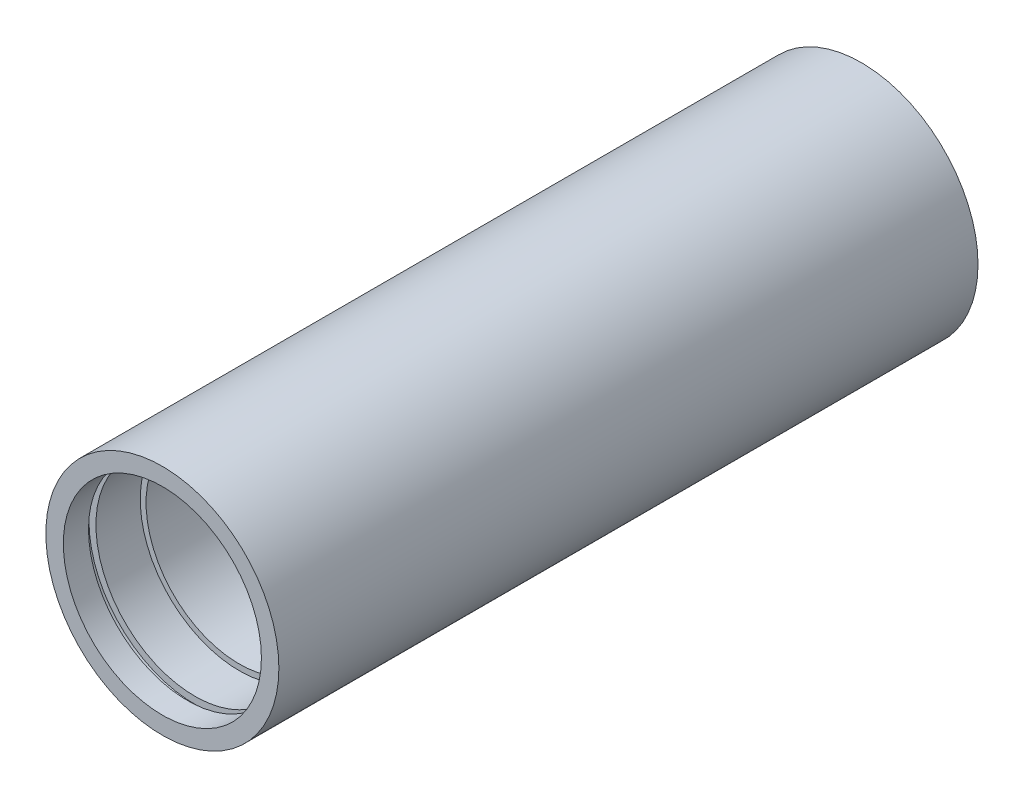
ISO-10303-21;
HEADER;
FILE_DESCRIPTION(('STEP AP214'),'2;1');
FILE_NAME('part.step','',(''),(''),'','','');
FILE_SCHEMA(('AUTOMOTIVE_DESIGN { 1 0 10303 214 1 1 1 1 }'));
ENDSEC;
DATA;
#1=APPLICATION_CONTEXT('core data for automotive mechanical design processes');
#2=APPLICATION_PROTOCOL_DEFINITION('international standard','automotive_design',2000,#1);
#3=PRODUCT_CONTEXT('',#1,'mechanical');
#4=PRODUCT('Part','Part','',(#3));
#5=PRODUCT_RELATED_PRODUCT_CATEGORY('part','',(#4));
#6=PRODUCT_DEFINITION_FORMATION('','',#4);
#7=PRODUCT_DEFINITION_CONTEXT('part definition',#1,'design');
#8=PRODUCT_DEFINITION('design','',#6,#7);
#9=PRODUCT_DEFINITION_SHAPE('','',#8);
#10=(LENGTH_UNIT() NAMED_UNIT(*) SI_UNIT(.MILLI.,.METRE.));
#11=(NAMED_UNIT(*) PLANE_ANGLE_UNIT() SI_UNIT($,.RADIAN.));
#12=(NAMED_UNIT(*) SI_UNIT($,.STERADIAN.) SOLID_ANGLE_UNIT());
#13=UNCERTAINTY_MEASURE_WITH_UNIT(LENGTH_MEASURE(1.E-05),#10,'distance_accuracy_value','');
#14=(GEOMETRIC_REPRESENTATION_CONTEXT(3) GLOBAL_UNCERTAINTY_ASSIGNED_CONTEXT((#13)) GLOBAL_UNIT_ASSIGNED_CONTEXT((#10,
#11,#12)) REPRESENTATION_CONTEXT('',''));
#15=CARTESIAN_POINT('',(0.,0.,0.));
#16=DIRECTION('',(0.,0.,1.));
#17=DIRECTION('',(1.,0.,0.));
#18=AXIS2_PLACEMENT_3D('',#15,#16,#17);
#19=CARTESIAN_POINT('',(0.,0.,-117.));
#20=DIRECTION('',(0.,0.,-1.));
#21=DIRECTION('',(-1.,0.,0.));
#22=AXIS2_PLACEMENT_3D('',#19,#20,#21);
#23=CYLINDRICAL_SURFACE('',#22,42.5);
#24=CARTESIAN_POINT('',(0.,0.,-150.));
#25=DIRECTION('',(0.,0.,1.));
#26=DIRECTION('',(1.,0.,0.));
#27=AXIS2_PLACEMENT_3D('',#24,#25,#26);
#28=CIRCLE('',#27,42.5);
#29=CARTESIAN_POINT('',(42.5,0.,-150.));
#30=VERTEX_POINT('',#29);
#31=EDGE_CURVE('E69',#30,#30,#28,.T.);
#32=ORIENTED_EDGE('',*,*,#31,.F.);
#33=EDGE_LOOP('',(#32));
#34=FACE_BOUND('',#33,.T.);
#35=CARTESIAN_POINT('',(0.,0.,-139.2));
#36=DIRECTION('',(0.,0.,1.));
#37=DIRECTION('',(1.,0.,0.));
#38=AXIS2_PLACEMENT_3D('',#35,#36,#37);
#39=CIRCLE('',#38,42.5);
#40=CARTESIAN_POINT('',(42.5,0.,-139.2));
#41=VERTEX_POINT('',#40);
#42=EDGE_CURVE('E36',#41,#41,#39,.T.);
#43=ORIENTED_EDGE('',*,*,#42,.T.);
#44=EDGE_LOOP('',(#43));
#45=FACE_BOUND('',#44,.T.);
#46=ADVANCED_FACE('F32',(#34,#45),#23,.F.);
#47=CARTESIAN_POINT('',(0.,0.,-117.));
#48=DIRECTION('',(0.,0.,1.));
#49=DIRECTION('',(1.,0.,0.));
#50=AXIS2_PLACEMENT_3D('',#47,#48,#49);
#51=CIRCLE('',#50,42.5);
#52=CARTESIAN_POINT('',(42.5,0.,-117.));
#53=VERTEX_POINT('',#52);
#54=EDGE_CURVE('E62',#53,#53,#51,.T.);
#55=ORIENTED_EDGE('',*,*,#54,.T.);
#56=EDGE_LOOP('',(#55));
#57=FACE_BOUND('',#56,.T.);
#58=CARTESIAN_POINT('',(0.,0.,-136.));
#59=DIRECTION('',(0.,0.,-1.));
#60=DIRECTION('',(-1.,0.,0.));
#61=AXIS2_PLACEMENT_3D('',#58,#59,#60);
#62=CIRCLE('',#61,42.5);
#63=CARTESIAN_POINT('',(-42.5,0.,-136.));
#64=VERTEX_POINT('',#63);
#65=EDGE_CURVE('E63',#64,#64,#62,.T.);
#66=ORIENTED_EDGE('',*,*,#65,.T.);
#67=EDGE_LOOP('',(#66));
#68=FACE_BOUND('',#67,.T.);
#69=ADVANCED_FACE('F110',(#57,#68),#23,.F.);
#70=CARTESIAN_POINT('',(0.,0.,-150.));
#71=DIRECTION('',(0.,0.,1.));
#72=DIRECTION('',(1.,0.,0.));
#73=AXIS2_PLACEMENT_3D('',#70,#71,#72);
#74=CYLINDRICAL_SURFACE('',#73,40.);
#75=CARTESIAN_POINT('',(0.,0.,117.));
#76=DIRECTION('',(0.,0.,1.));
#77=DIRECTION('',(1.,0.,0.));
#78=AXIS2_PLACEMENT_3D('',#75,#76,#77);
#79=CIRCLE('',#78,40.);
#80=CARTESIAN_POINT('',(40.,0.,117.));
#81=VERTEX_POINT('',#80);
#82=EDGE_CURVE('E58',#81,#81,#79,.T.);
#83=ORIENTED_EDGE('',*,*,#82,.T.);
#84=EDGE_LOOP('',(#83));
#85=FACE_BOUND('',#84,.T.);
#86=CARTESIAN_POINT('',(0.,0.,-117.));
#87=DIRECTION('',(0.,0.,-1.));
#88=DIRECTION('',(-1.,0.,0.));
#89=AXIS2_PLACEMENT_3D('',#86,#87,#88);
#90=CIRCLE('',#89,40.);
#91=CARTESIAN_POINT('',(-40.,0.,-117.));
#92=VERTEX_POINT('',#91);
#93=EDGE_CURVE('E59',#92,#92,#90,.F.);
#94=ORIENTED_EDGE('',*,*,#93,.F.);
#95=EDGE_LOOP('',(#94));
#96=FACE_BOUND('',#95,.T.);
#97=ADVANCED_FACE('F116',(#85,#96),#74,.F.);
#98=CARTESIAN_POINT('',(0.,0.,117.));
#99=DIRECTION('',(0.,0.,1.));
#100=DIRECTION('',(1.,0.,0.));
#101=AXIS2_PLACEMENT_3D('',#98,#99,#100);
#102=CYLINDRICAL_SURFACE('',#101,42.5);
#103=CARTESIAN_POINT('',(0.,0.,150.));
#104=DIRECTION('',(0.,0.,1.));
#105=DIRECTION('',(1.,0.,0.));
#106=AXIS2_PLACEMENT_3D('',#103,#104,#105);
#107=CIRCLE('',#106,42.5);
#108=CARTESIAN_POINT('',(42.5,0.,150.));
#109=VERTEX_POINT('',#108);
#110=EDGE_CURVE('E48',#109,#109,#107,.T.);
#111=ORIENTED_EDGE('',*,*,#110,.T.);
#112=EDGE_LOOP('',(#111));
#113=FACE_BOUND('',#112,.T.);
#114=CARTESIAN_POINT('',(0.,0.,139.2));
#115=DIRECTION('',(0.,0.,-1.));
#116=DIRECTION('',(-1.,0.,0.));
#117=AXIS2_PLACEMENT_3D('',#114,#115,#116);
#118=CIRCLE('',#117,42.5);
#119=CARTESIAN_POINT('',(-42.5,0.,139.2));
#120=VERTEX_POINT('',#119);
#121=EDGE_CURVE('E54',#120,#120,#118,.F.);
#122=ORIENTED_EDGE('',*,*,#121,.F.);
#123=EDGE_LOOP('',(#122));
#124=FACE_BOUND('',#123,.T.);
#125=ADVANCED_FACE('F93',(#113,#124),#102,.F.);
#126=CARTESIAN_POINT('',(0.,0.,117.));
#127=DIRECTION('',(0.,0.,1.));
#128=DIRECTION('',(1.,0.,0.));
#129=AXIS2_PLACEMENT_3D('',#126,#127,#128);
#130=CIRCLE('',#129,42.5);
#131=CARTESIAN_POINT('',(42.5,0.,117.));
#132=VERTEX_POINT('',#131);
#133=EDGE_CURVE('E45',#132,#132,#130,.T.);
#134=ORIENTED_EDGE('',*,*,#133,.F.);
#135=EDGE_LOOP('',(#134));
#136=FACE_BOUND('',#135,.T.);
#137=CARTESIAN_POINT('',(0.,0.,136.));
#138=DIRECTION('',(0.,0.,1.));
#139=DIRECTION('',(1.,0.,0.));
#140=AXIS2_PLACEMENT_3D('',#137,#138,#139);
#141=CIRCLE('',#140,42.5);
#142=CARTESIAN_POINT('',(42.5,0.,136.));
#143=VERTEX_POINT('',#142);
#144=EDGE_CURVE('E51',#143,#143,#141,.F.);
#145=ORIENTED_EDGE('',*,*,#144,.F.);
#146=EDGE_LOOP('',(#145));
#147=FACE_BOUND('',#146,.T.);
#148=ADVANCED_FACE('F106',(#136,#147),#102,.F.);
#149=CARTESIAN_POINT('',(0.,0.,150.));
#150=DIRECTION('',(0.,0.,-1.));
#151=DIRECTION('',(-1.,0.,0.));
#152=AXIS2_PLACEMENT_3D('',#149,#150,#151);
#153=CYLINDRICAL_SURFACE('',#152,50.);
#154=CARTESIAN_POINT('',(0.,0.,150.));
#155=DIRECTION('',(0.,0.,1.));
#156=DIRECTION('',(1.,0.,0.));
#157=AXIS2_PLACEMENT_3D('',#154,#155,#156);
#158=CIRCLE('',#157,50.);
#159=CARTESIAN_POINT('',(50.,0.,150.));
#160=VERTEX_POINT('',#159);
#161=EDGE_CURVE('E10',#160,#160,#158,.T.);
#162=ORIENTED_EDGE('',*,*,#161,.F.);
#163=EDGE_LOOP('',(#162));
#164=FACE_BOUND('',#163,.T.);
#165=CARTESIAN_POINT('',(0.,0.,-150.));
#166=DIRECTION('',(0.,0.,1.));
#167=DIRECTION('',(1.,0.,0.));
#168=AXIS2_PLACEMENT_3D('',#165,#166,#167);
#169=CIRCLE('',#168,50.);
#170=CARTESIAN_POINT('',(50.,0.,-150.));
#171=VERTEX_POINT('',#170);
#172=EDGE_CURVE('E40',#171,#171,#169,.T.);
#173=ORIENTED_EDGE('',*,*,#172,.T.);
#174=EDGE_LOOP('',(#173));
#175=FACE_BOUND('',#174,.T.);
#176=ADVANCED_FACE('F34',(#164,#175),#153,.T.);
#177=CARTESIAN_POINT('',(0.,0.,150.));
#178=DIRECTION('',(0.,0.,1.));
#179=DIRECTION('',(1.,0.,0.));
#180=AXIS2_PLACEMENT_3D('',#177,#178,#179);
#181=PLANE('',#180);
#182=ORIENTED_EDGE('',*,*,#110,.F.);
#183=EDGE_LOOP('',(#182));
#184=FACE_BOUND('',#183,.T.);
#185=ORIENTED_EDGE('',*,*,#161,.T.);
#186=EDGE_LOOP('',(#185));
#187=FACE_BOUND('',#186,.T.);
#188=ADVANCED_FACE('F96',(#184,#187),#181,.T.);
#189=CARTESIAN_POINT('',(0.,0.,-150.));
#190=DIRECTION('',(0.,0.,1.));
#191=DIRECTION('',(1.,0.,0.));
#192=AXIS2_PLACEMENT_3D('',#189,#190,#191);
#193=PLANE('',#192);
#194=ORIENTED_EDGE('',*,*,#31,.T.);
#195=EDGE_LOOP('',(#194));
#196=FACE_BOUND('',#195,.T.);
#197=ORIENTED_EDGE('',*,*,#172,.F.);
#198=EDGE_LOOP('',(#197));
#199=FACE_BOUND('',#198,.T.);
#200=ADVANCED_FACE('F98',(#196,#199),#193,.F.);
#201=CARTESIAN_POINT('',(0.,0.,117.));
#202=DIRECTION('',(0.,0.,1.));
#203=DIRECTION('',(1.,0.,0.));
#204=AXIS2_PLACEMENT_3D('',#201,#202,#203);
#205=PLANE('',#204);
#206=ORIENTED_EDGE('',*,*,#82,.F.);
#207=EDGE_LOOP('',(#206));
#208=FACE_BOUND('',#207,.T.);
#209=ORIENTED_EDGE('',*,*,#133,.T.);
#210=EDGE_LOOP('',(#209));
#211=FACE_BOUND('',#210,.T.);
#212=ADVANCED_FACE('F104',(#208,#211),#205,.T.);
#213=CARTESIAN_POINT('',(35.5,0.,139.2));
#214=DIRECTION('',(0.,0.,-1.));
#215=DIRECTION('',(-1.,0.,0.));
#216=AXIS2_PLACEMENT_3D('',#213,#214,#215);
#217=PLANE('',#216);
#218=CARTESIAN_POINT('',(0.,0.,139.2));
#219=DIRECTION('',(0.,0.,-1.));
#220=DIRECTION('',(-1.,0.,0.));
#221=AXIS2_PLACEMENT_3D('',#218,#219,#220);
#222=CIRCLE('',#221,45.5);
#223=CARTESIAN_POINT('',(-45.5,0.,139.2));
#224=VERTEX_POINT('',#223);
#225=EDGE_CURVE('E55',#224,#224,#222,.T.);
#226=ORIENTED_EDGE('',*,*,#225,.T.);
#227=EDGE_LOOP('',(#226));
#228=FACE_BOUND('',#227,.T.);
#229=ORIENTED_EDGE('',*,*,#121,.T.);
#230=EDGE_LOOP('',(#229));
#231=FACE_BOUND('',#230,.T.);
#232=ADVANCED_FACE('F128',(#228,#231),#217,.T.);
#233=CARTESIAN_POINT('',(35.5,0.,136.));
#234=DIRECTION('',(0.,0.,1.));
#235=DIRECTION('',(1.,0.,0.));
#236=AXIS2_PLACEMENT_3D('',#233,#234,#235);
#237=PLANE('',#236);
#238=CARTESIAN_POINT('',(0.,0.,136.));
#239=DIRECTION('',(0.,0.,-1.));
#240=DIRECTION('',(-1.,0.,0.));
#241=AXIS2_PLACEMENT_3D('',#238,#239,#240);
#242=CIRCLE('',#241,45.5);
#243=CARTESIAN_POINT('',(-45.5,0.,136.));
#244=VERTEX_POINT('',#243);
#245=EDGE_CURVE('E61',#244,#244,#242,.T.);
#246=ORIENTED_EDGE('',*,*,#245,.F.);
#247=EDGE_LOOP('',(#246));
#248=FACE_BOUND('',#247,.T.);
#249=ORIENTED_EDGE('',*,*,#144,.T.);
#250=EDGE_LOOP('',(#249));
#251=FACE_BOUND('',#250,.T.);
#252=ADVANCED_FACE('F124',(#248,#251),#237,.T.);
#253=CARTESIAN_POINT('',(0.,0.,150.));
#254=DIRECTION('',(0.,0.,-1.));
#255=DIRECTION('',(-1.,0.,0.));
#256=AXIS2_PLACEMENT_3D('',#253,#254,#255);
#257=CYLINDRICAL_SURFACE('',#256,45.5);
#258=ORIENTED_EDGE('',*,*,#245,.T.);
#259=EDGE_LOOP('',(#258));
#260=FACE_BOUND('',#259,.T.);
#261=ORIENTED_EDGE('',*,*,#225,.F.);
#262=EDGE_LOOP('',(#261));
#263=FACE_BOUND('',#262,.T.);
#264=ADVANCED_FACE('F127',(#260,#263),#257,.F.);
#265=CARTESIAN_POINT('',(0.,0.,-117.));
#266=DIRECTION('',(0.,0.,-1.));
#267=DIRECTION('',(1.,0.,0.));
#268=AXIS2_PLACEMENT_3D('',#265,#266,#267);
#269=PLANE('',#268);
#270=ORIENTED_EDGE('',*,*,#54,.F.);
#271=EDGE_LOOP('',(#270));
#272=FACE_BOUND('',#271,.T.);
#273=ORIENTED_EDGE('',*,*,#93,.T.);
#274=EDGE_LOOP('',(#273));
#275=FACE_BOUND('',#274,.T.);
#276=ADVANCED_FACE('F122',(#272,#275),#269,.T.);
#277=CARTESIAN_POINT('',(35.5,0.,-139.2));
#278=DIRECTION('',(0.,0.,1.));
#279=DIRECTION('',(-1.,0.,0.));
#280=AXIS2_PLACEMENT_3D('',#277,#278,#279);
#281=PLANE('',#280);
#282=ORIENTED_EDGE('',*,*,#42,.F.);
#283=EDGE_LOOP('',(#282));
#284=FACE_BOUND('',#283,.T.);
#285=CARTESIAN_POINT('',(0.,0.,-139.2));
#286=DIRECTION('',(0.,0.,-1.));
#287=DIRECTION('',(-1.,0.,0.));
#288=AXIS2_PLACEMENT_3D('',#285,#286,#287);
#289=CIRCLE('',#288,45.5);
#290=CARTESIAN_POINT('',(-45.5,0.,-139.2));
#291=VERTEX_POINT('',#290);
#292=EDGE_CURVE('E65',#291,#291,#289,.T.);
#293=ORIENTED_EDGE('',*,*,#292,.F.);
#294=EDGE_LOOP('',(#293));
#295=FACE_BOUND('',#294,.T.);
#296=ADVANCED_FACE('F200',(#284,#295),#281,.T.);
#297=CARTESIAN_POINT('',(0.,0.,-150.));
#298=DIRECTION('',(0.,0.,1.));
#299=DIRECTION('',(-1.,0.,0.));
#300=AXIS2_PLACEMENT_3D('',#297,#298,#299);
#301=CYLINDRICAL_SURFACE('',#300,45.5);
#302=CARTESIAN_POINT('',(0.,0.,-136.));
#303=DIRECTION('',(0.,0.,-1.));
#304=DIRECTION('',(-1.,0.,0.));
#305=AXIS2_PLACEMENT_3D('',#302,#303,#304);
#306=CIRCLE('',#305,45.5);
#307=CARTESIAN_POINT('',(-45.5,0.,-136.));
#308=VERTEX_POINT('',#307);
#309=EDGE_CURVE('E71',#308,#308,#306,.T.);
#310=ORIENTED_EDGE('',*,*,#309,.F.);
#311=EDGE_LOOP('',(#310));
#312=FACE_BOUND('',#311,.T.);
#313=ORIENTED_EDGE('',*,*,#292,.T.);
#314=EDGE_LOOP('',(#313));
#315=FACE_BOUND('',#314,.T.);
#316=ADVANCED_FACE('F210',(#312,#315),#301,.F.);
#317=CARTESIAN_POINT('',(35.5,0.,-136.));
#318=DIRECTION('',(0.,0.,-1.));
#319=DIRECTION('',(1.,0.,0.));
#320=AXIS2_PLACEMENT_3D('',#317,#318,#319);
#321=PLANE('',#320);
#322=ORIENTED_EDGE('',*,*,#65,.F.);
#323=EDGE_LOOP('',(#322));
#324=FACE_BOUND('',#323,.T.);
#325=ORIENTED_EDGE('',*,*,#309,.T.);
#326=EDGE_LOOP('',(#325));
#327=FACE_BOUND('',#326,.T.);
#328=ADVANCED_FACE('F220',(#324,#327),#321,.T.);
#329=CLOSED_SHELL('',(#46,#69,#97,#125,#148,#176,#188,#200,#212,#232,#252,#264,#276,#296,#316,#328));
#330=MANIFOLD_SOLID_BREP('B2',#329);
#331=ADVANCED_BREP_SHAPE_REPRESENTATION('',(#18,#330),#14);
#332=SHAPE_DEFINITION_REPRESENTATION(#9,#331);
ENDSEC;
END-ISO-10303-21;
